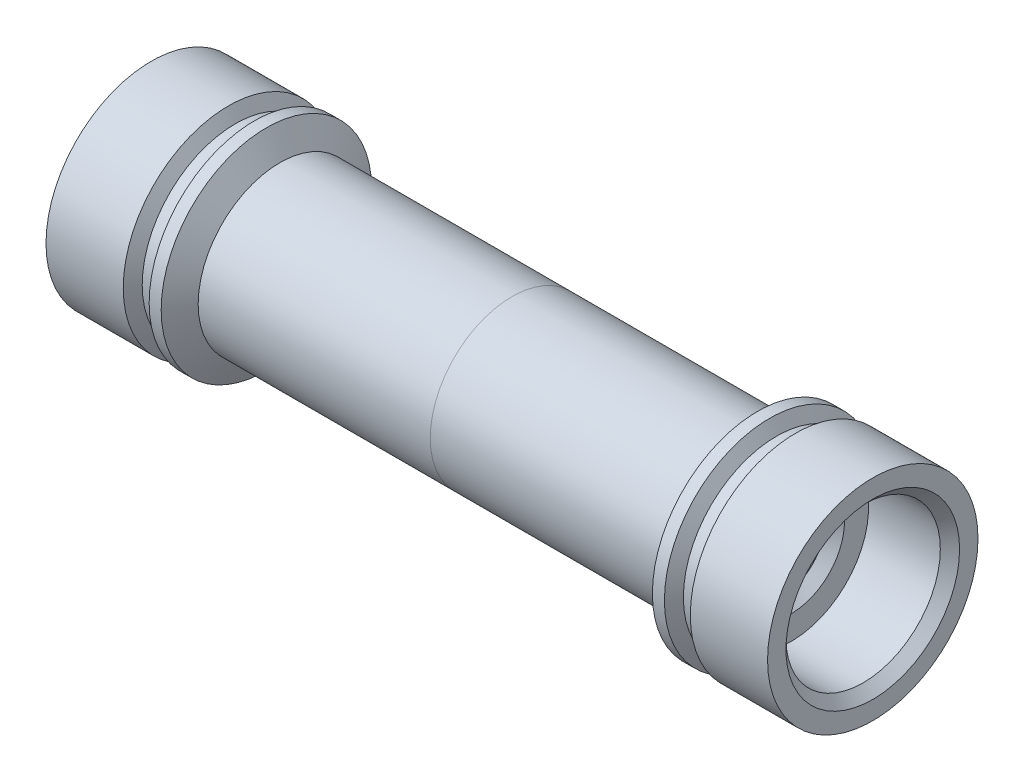
ISO-10303-21;
HEADER;
FILE_DESCRIPTION(('STEP AP214'),'2;1');
FILE_NAME('part.step','',(''),(''),'','','');
FILE_SCHEMA(('AUTOMOTIVE_DESIGN { 1 0 10303 214 1 1 1 1 }'));
ENDSEC;
DATA;
#1=APPLICATION_CONTEXT('core data for automotive mechanical design processes');
#2=APPLICATION_PROTOCOL_DEFINITION('international standard','automotive_design',2000,#1);
#3=PRODUCT_CONTEXT('',#1,'mechanical');
#4=PRODUCT('Part','Part','',(#3));
#5=PRODUCT_RELATED_PRODUCT_CATEGORY('part','',(#4));
#6=PRODUCT_DEFINITION_FORMATION('','',#4);
#7=PRODUCT_DEFINITION_CONTEXT('part definition',#1,'design');
#8=PRODUCT_DEFINITION('design','',#6,#7);
#9=PRODUCT_DEFINITION_SHAPE('','',#8);
#10=(LENGTH_UNIT() NAMED_UNIT(*) SI_UNIT(.MILLI.,.METRE.));
#11=(NAMED_UNIT(*) PLANE_ANGLE_UNIT() SI_UNIT($,.RADIAN.));
#12=(NAMED_UNIT(*) SI_UNIT($,.STERADIAN.) SOLID_ANGLE_UNIT());
#13=UNCERTAINTY_MEASURE_WITH_UNIT(LENGTH_MEASURE(1.E-05),#10,'distance_accuracy_value','');
#14=(GEOMETRIC_REPRESENTATION_CONTEXT(3) GLOBAL_UNCERTAINTY_ASSIGNED_CONTEXT((#13)) GLOBAL_UNIT_ASSIGNED_CONTEXT((#10,
#11,#12)) REPRESENTATION_CONTEXT('',''));
#15=CARTESIAN_POINT('',(0.,0.,0.));
#16=DIRECTION('',(0.,0.,1.));
#17=DIRECTION('',(1.,0.,0.));
#18=AXIS2_PLACEMENT_3D('',#15,#16,#17);
#19=CARTESIAN_POINT('',(12.9683825790646,0.,0.));
#20=DIRECTION('',(1.,0.,0.));
#21=DIRECTION('',(0.,0.,1.));
#22=AXIS2_PLACEMENT_3D('',#19,#20,#21);
#23=CONICAL_SURFACE('',#22,5.55625,1.0471975511966);
#24=CARTESIAN_POINT('',(12.2534786082405,0.,0.));
#25=DIRECTION('',(-1.,0.,0.));
#26=DIRECTION('',(0.,0.,1.));
#27=AXIS2_PLACEMENT_3D('',#24,#25,#26);
#28=CIRCLE('',#27,4.318);
#29=CARTESIAN_POINT('',(12.2534786082405,0.,4.318));
#30=VERTEX_POINT('',#29);
#31=EDGE_CURVE('E351',#30,#30,#28,.T.);
#32=ORIENTED_EDGE('',*,*,#31,.F.);
#33=EDGE_LOOP('',(#32));
#34=FACE_BOUND('',#33,.T.);
#35=CARTESIAN_POINT('',(12.9683825790646,0.,0.));
#36=DIRECTION('',(-1.,0.,0.));
#37=DIRECTION('',(0.,0.,1.));
#38=AXIS2_PLACEMENT_3D('',#35,#36,#37);
#39=CIRCLE('',#38,5.55625);
#40=CARTESIAN_POINT('',(12.9683825790646,0.,5.55625));
#41=VERTEX_POINT('',#40);
#42=EDGE_CURVE('E133',#41,#41,#39,.T.);
#43=ORIENTED_EDGE('',*,*,#42,.T.);
#44=EDGE_LOOP('',(#43));
#45=FACE_BOUND('',#44,.T.);
#46=ADVANCED_FACE('F63',(#34,#45),#23,.T.);
#47=CARTESIAN_POINT('',(19.05,0.,0.));
#48=DIRECTION('',(1.,0.,0.));
#49=DIRECTION('',(0.,0.,1.));
#50=AXIS2_PLACEMENT_3D('',#47,#48,#49);
#51=CYLINDRICAL_SURFACE('',#50,5.55625);
#52=ORIENTED_EDGE('',*,*,#42,.F.);
#53=EDGE_LOOP('',(#52));
#54=FACE_BOUND('',#53,.T.);
#55=CARTESIAN_POINT('',(13.6033825790646,0.,0.));
#56=DIRECTION('',(-1.,0.,0.));
#57=DIRECTION('',(0.,0.,1.));
#58=AXIS2_PLACEMENT_3D('',#55,#56,#57);
#59=CIRCLE('',#58,5.55625);
#60=CARTESIAN_POINT('',(13.6033825790646,0.,5.55625));
#61=VERTEX_POINT('',#60);
#62=EDGE_CURVE('E129',#61,#61,#59,.T.);
#63=ORIENTED_EDGE('',*,*,#62,.T.);
#64=EDGE_LOOP('',(#63));
#65=FACE_BOUND('',#64,.T.);
#66=ADVANCED_FACE('F160',(#54,#65),#51,.T.);
#67=CARTESIAN_POINT('',(13.97,0.,0.));
#68=DIRECTION('',(-1.,0.,0.));
#69=DIRECTION('',(0.,0.,-1.));
#70=AXIS2_PLACEMENT_3D('',#67,#68,#69);
#71=CONICAL_SURFACE('',#70,4.92125,1.0471975511966);
#72=ORIENTED_EDGE('',*,*,#62,.F.);
#73=EDGE_LOOP('',(#72));
#74=FACE_BOUND('',#73,.T.);
#75=CARTESIAN_POINT('',(13.97,0.,0.));
#76=DIRECTION('',(-1.,0.,0.));
#77=DIRECTION('',(0.,0.,1.));
#78=AXIS2_PLACEMENT_3D('',#75,#76,#77);
#79=CIRCLE('',#78,4.92125);
#80=CARTESIAN_POINT('',(13.97,0.,4.92125));
#81=VERTEX_POINT('',#80);
#82=EDGE_CURVE('E125',#81,#81,#79,.T.);
#83=ORIENTED_EDGE('',*,*,#82,.T.);
#84=EDGE_LOOP('',(#83));
#85=FACE_BOUND('',#84,.T.);
#86=ADVANCED_FACE('F164',(#74,#85),#71,.T.);
#87=CARTESIAN_POINT('',(19.05,0.,0.));
#88=DIRECTION('',(1.,0.,0.));
#89=DIRECTION('',(0.,0.,1.));
#90=AXIS2_PLACEMENT_3D('',#87,#88,#89);
#91=CYLINDRICAL_SURFACE('',#90,4.92125);
#92=ORIENTED_EDGE('',*,*,#82,.F.);
#93=EDGE_LOOP('',(#92));
#94=FACE_BOUND('',#93,.T.);
#95=CARTESIAN_POINT('',(14.605,0.,0.));
#96=DIRECTION('',(-1.,0.,0.));
#97=DIRECTION('',(0.,0.,1.));
#98=AXIS2_PLACEMENT_3D('',#95,#96,#97);
#99=CIRCLE('',#98,4.92125);
#100=CARTESIAN_POINT('',(14.605,0.,4.92125));
#101=VERTEX_POINT('',#100);
#102=EDGE_CURVE('E121',#101,#101,#99,.T.);
#103=ORIENTED_EDGE('',*,*,#102,.T.);
#104=EDGE_LOOP('',(#103));
#105=FACE_BOUND('',#104,.T.);
#106=ADVANCED_FACE('F172',(#94,#105),#91,.T.);
#107=CARTESIAN_POINT('',(14.9716174209354,0.,0.));
#108=DIRECTION('',(1.,0.,0.));
#109=DIRECTION('',(0.,0.,1.));
#110=AXIS2_PLACEMENT_3D('',#107,#108,#109);
#111=CONICAL_SURFACE('',#110,5.55625,1.0471975511966);
#112=ORIENTED_EDGE('',*,*,#102,.F.);
#113=EDGE_LOOP('',(#112));
#114=FACE_BOUND('',#113,.T.);
#115=CARTESIAN_POINT('',(14.9716174209354,0.,0.));
#116=DIRECTION('',(-1.,0.,0.));
#117=DIRECTION('',(0.,0.,1.));
#118=AXIS2_PLACEMENT_3D('',#115,#116,#117);
#119=CIRCLE('',#118,5.55625);
#120=CARTESIAN_POINT('',(14.9716174209354,0.,5.55625));
#121=VERTEX_POINT('',#120);
#122=EDGE_CURVE('E117',#121,#121,#119,.T.);
#123=ORIENTED_EDGE('',*,*,#122,.T.);
#124=EDGE_LOOP('',(#123));
#125=FACE_BOUND('',#124,.T.);
#126=ADVANCED_FACE('F176',(#114,#125),#111,.T.);
#127=CARTESIAN_POINT('',(19.05,0.,0.));
#128=DIRECTION('',(1.,0.,0.));
#129=DIRECTION('',(0.,0.,1.));
#130=AXIS2_PLACEMENT_3D('',#127,#128,#129);
#131=CYLINDRICAL_SURFACE('',#130,5.55625);
#132=ORIENTED_EDGE('',*,*,#122,.F.);
#133=EDGE_LOOP('',(#132));
#134=FACE_BOUND('',#133,.T.);
#135=CARTESIAN_POINT('',(19.05,0.,0.));
#136=DIRECTION('',(-1.,0.,0.));
#137=DIRECTION('',(0.,0.,1.));
#138=AXIS2_PLACEMENT_3D('',#135,#136,#137);
#139=CIRCLE('',#138,5.55625);
#140=CARTESIAN_POINT('',(19.05,0.,5.55625));
#141=VERTEX_POINT('',#140);
#142=EDGE_CURVE('E113',#141,#141,#139,.T.);
#143=ORIENTED_EDGE('',*,*,#142,.T.);
#144=EDGE_LOOP('',(#143));
#145=FACE_BOUND('',#144,.T.);
#146=ADVANCED_FACE('F180',(#134,#145),#131,.T.);
#147=CARTESIAN_POINT('',(19.05,0.,0.));
#148=DIRECTION('',(-1.,0.,0.));
#149=DIRECTION('',(0.,0.,-1.));
#150=AXIS2_PLACEMENT_3D('',#147,#148,#149);
#151=PLANE('',#150);
#152=CARTESIAN_POINT('',(19.05,0.,0.));
#153=DIRECTION('',(1.,0.,0.));
#154=DIRECTION('',(0.,0.,-1.));
#155=AXIS2_PLACEMENT_3D('',#152,#153,#154);
#156=CIRCLE('',#155,4.58300000000001);
#157=CARTESIAN_POINT('',(19.05,0.,-4.58300000000001));
#158=VERTEX_POINT('',#157);
#159=EDGE_CURVE('E12',#158,#158,#156,.T.);
#160=ORIENTED_EDGE('',*,*,#159,.F.);
#161=EDGE_LOOP('',(#160));
#162=FACE_BOUND('',#161,.T.);
#163=ORIENTED_EDGE('',*,*,#142,.F.);
#164=EDGE_LOOP('',(#163));
#165=FACE_BOUND('',#164,.T.);
#166=ADVANCED_FACE('F146',(#162,#165),#151,.F.);
#167=CARTESIAN_POINT('',(19.05,0.,0.));
#168=DIRECTION('',(1.,0.,0.));
#169=DIRECTION('',(0.,0.,1.));
#170=AXIS2_PLACEMENT_3D('',#167,#168,#169);
#171=CYLINDRICAL_SURFACE('',#170,4.075);
#172=CARTESIAN_POINT('',(18.542,0.,0.));
#173=DIRECTION('',(1.,0.,0.));
#174=DIRECTION('',(0.,0.,-1.));
#175=AXIS2_PLACEMENT_3D('',#172,#173,#174);
#176=CIRCLE('',#175,4.075);
#177=CARTESIAN_POINT('',(18.542,0.,-4.075));
#178=VERTEX_POINT('',#177);
#179=EDGE_CURVE('E71',#178,#178,#176,.F.);
#180=ORIENTED_EDGE('',*,*,#179,.F.);
#181=EDGE_LOOP('',(#180));
#182=FACE_BOUND('',#181,.T.);
#183=CARTESIAN_POINT('',(14.749999964,0.,0.));
#184=DIRECTION('',(-1.,0.,0.));
#185=DIRECTION('',(0.,0.,1.));
#186=AXIS2_PLACEMENT_3D('',#183,#184,#185);
#187=CIRCLE('',#186,4.075);
#188=CARTESIAN_POINT('',(14.749999964,0.,4.075));
#189=VERTEX_POINT('',#188);
#190=EDGE_CURVE('E109',#189,#189,#187,.T.);
#191=ORIENTED_EDGE('',*,*,#190,.T.);
#192=EDGE_LOOP('',(#191));
#193=FACE_BOUND('',#192,.T.);
#194=ADVANCED_FACE('F142',(#182,#193),#171,.F.);
#195=CARTESIAN_POINT('',(14.749999964,0.,0.));
#196=DIRECTION('',(-1.,0.,0.));
#197=DIRECTION('',(0.,0.,-1.));
#198=AXIS2_PLACEMENT_3D('',#195,#196,#197);
#199=PLANE('',#198);
#200=CARTESIAN_POINT('',(14.749999964,0.,0.));
#201=DIRECTION('',(-1.,0.,0.));
#202=DIRECTION('',(0.,0.,1.));
#203=AXIS2_PLACEMENT_3D('',#200,#201,#202);
#204=CIRCLE('',#203,2.805);
#205=CARTESIAN_POINT('',(14.749999964,0.,2.805));
#206=VERTEX_POINT('',#205);
#207=EDGE_CURVE('E105',#206,#206,#204,.T.);
#208=ORIENTED_EDGE('',*,*,#207,.T.);
#209=EDGE_LOOP('',(#208));
#210=FACE_BOUND('',#209,.T.);
#211=ORIENTED_EDGE('',*,*,#190,.F.);
#212=EDGE_LOOP('',(#211));
#213=FACE_BOUND('',#212,.T.);
#214=ADVANCED_FACE('F145',(#210,#213),#199,.F.);
#215=CARTESIAN_POINT('',(14.749999964,0.,0.));
#216=DIRECTION('',(1.,0.,0.));
#217=DIRECTION('',(0.,0.,1.));
#218=AXIS2_PLACEMENT_3D('',#215,#216,#217);
#219=CONICAL_SURFACE('',#218,2.805,0.785398163397447);
#220=CARTESIAN_POINT('',(14.241999964,0.,0.));
#221=DIRECTION('',(-1.,0.,0.));
#222=DIRECTION('',(0.,0.,1.));
#223=AXIS2_PLACEMENT_3D('',#220,#221,#222);
#224=CIRCLE('',#223,2.297);
#225=CARTESIAN_POINT('',(14.241999964,0.,2.297));
#226=VERTEX_POINT('',#225);
#227=EDGE_CURVE('E102',#226,#226,#224,.T.);
#228=ORIENTED_EDGE('',*,*,#227,.T.);
#229=EDGE_LOOP('',(#228));
#230=FACE_BOUND('',#229,.T.);
#231=ORIENTED_EDGE('',*,*,#207,.F.);
#232=EDGE_LOOP('',(#231));
#233=FACE_BOUND('',#232,.T.);
#234=ADVANCED_FACE('F151',(#230,#233),#219,.F.);
#235=CARTESIAN_POINT('',(14.241999964,0.,0.));
#236=DIRECTION('',(-1.,0.,0.));
#237=DIRECTION('',(0.,0.,-1.));
#238=AXIS2_PLACEMENT_3D('',#235,#236,#237);
#239=PLANE('',#238);
#240=CARTESIAN_POINT('',(14.241999964,0.,0.));
#241=DIRECTION('',(-1.,0.,0.));
#242=DIRECTION('',(0.,0.,1.));
#243=AXIS2_PLACEMENT_3D('',#240,#241,#242);
#244=CIRCLE('',#243,1.905);
#245=CARTESIAN_POINT('',(14.241999964,0.,1.905));
#246=VERTEX_POINT('',#245);
#247=EDGE_CURVE('E91',#246,#246,#244,.T.);
#248=ORIENTED_EDGE('',*,*,#247,.T.);
#249=EDGE_LOOP('',(#248));
#250=FACE_BOUND('',#249,.T.);
#251=ORIENTED_EDGE('',*,*,#227,.F.);
#252=EDGE_LOOP('',(#251));
#253=FACE_BOUND('',#252,.T.);
#254=ADVANCED_FACE('F156',(#250,#253),#239,.F.);
#255=CARTESIAN_POINT('',(19.05,0.,0.));
#256=DIRECTION('',(1.,0.,0.));
#257=DIRECTION('',(0.,0.,1.));
#258=AXIS2_PLACEMENT_3D('',#255,#256,#257);
#259=CYLINDRICAL_SURFACE('',#258,1.905);
#260=CARTESIAN_POINT('',(9.098,0.,0.));
#261=DIRECTION('',(-1.,0.,0.));
#262=DIRECTION('',(0.,0.,1.));
#263=AXIS2_PLACEMENT_3D('',#260,#261,#262);
#264=CIRCLE('',#263,1.905);
#265=CARTESIAN_POINT('',(9.098,0.,1.905));
#266=VERTEX_POINT('',#265);
#267=EDGE_CURVE('E85',#266,#266,#264,.T.);
#268=ORIENTED_EDGE('',*,*,#267,.T.);
#269=EDGE_LOOP('',(#268));
#270=FACE_BOUND('',#269,.T.);
#271=ORIENTED_EDGE('',*,*,#247,.F.);
#272=EDGE_LOOP('',(#271));
#273=FACE_BOUND('',#272,.T.);
#274=ADVANCED_FACE('F211',(#270,#273),#259,.F.);
#275=CARTESIAN_POINT('',(9.098,0.,0.));
#276=DIRECTION('',(-1.,0.,0.));
#277=DIRECTION('',(0.,0.,-1.));
#278=AXIS2_PLACEMENT_3D('',#275,#276,#277);
#279=PLANE('',#278);
#280=ORIENTED_EDGE('',*,*,#267,.F.);
#281=EDGE_LOOP('',(#280));
#282=FACE_BOUND('',#281,.T.);
#283=ADVANCED_FACE('F78',(#282),#279,.F.);
#284=CARTESIAN_POINT('',(6.5,0.,0.));
#285=DIRECTION('',(-1.,0.,0.));
#286=DIRECTION('',(0.,0.,-1.));
#287=AXIS2_PLACEMENT_3D('',#284,#285,#286);
#288=CONICAL_SURFACE('',#287,1.625000052,0.78539816339745);
#289=CARTESIAN_POINT('',(8.12500005199999,0.,0.));
#290=VERTEX_POINT('',#289);
#291=VERTEX_LOOP('',#290);
#292=FACE_BOUND('',#291,.T.);
#293=CARTESIAN_POINT('',(6.5,0.,0.));
#294=DIRECTION('',(-1.,0.,0.));
#295=DIRECTION('',(0.,0.,1.));
#296=AXIS2_PLACEMENT_3D('',#293,#294,#295);
#297=CIRCLE('',#296,1.625000052);
#298=CARTESIAN_POINT('',(6.5,0.,1.625000052));
#299=VERTEX_POINT('',#298);
#300=EDGE_CURVE('E82',#299,#299,#297,.T.);
#301=ORIENTED_EDGE('',*,*,#300,.T.);
#302=EDGE_LOOP('',(#301));
#303=FACE_BOUND('',#302,.T.);
#304=ADVANCED_FACE('F74',(#292,#303),#288,.F.);
#305=CARTESIAN_POINT('',(19.05,0.,0.));
#306=DIRECTION('',(1.,0.,0.));
#307=DIRECTION('',(0.,0.,1.));
#308=AXIS2_PLACEMENT_3D('',#305,#306,#307);
#309=CYLINDRICAL_SURFACE('',#308,1.625000052);
#310=ORIENTED_EDGE('',*,*,#300,.F.);
#311=EDGE_LOOP('',(#310));
#312=FACE_BOUND('',#311,.T.);
#313=CARTESIAN_POINT('',(0.,0.,0.));
#314=DIRECTION('',(-1.,0.,0.));
#315=DIRECTION('',(0.,0.,1.));
#316=AXIS2_PLACEMENT_3D('',#313,#314,#315);
#317=CIRCLE('',#316,1.625000052);
#318=CARTESIAN_POINT('',(0.,0.,1.625000052));
#319=VERTEX_POINT('',#318);
#320=EDGE_CURVE('E86',#319,#319,#317,.T.);
#321=ORIENTED_EDGE('',*,*,#320,.T.);
#322=EDGE_LOOP('',(#321));
#323=FACE_BOUND('',#322,.T.);
#324=ADVANCED_FACE('F77',(#312,#323),#309,.F.);
#325=CARTESIAN_POINT('',(0.,0.,0.));
#326=DIRECTION('',(1.,0.,0.));
#327=DIRECTION('',(0.,0.,1.));
#328=AXIS2_PLACEMENT_3D('',#325,#326,#327);
#329=PLANE('',#328);
#330=CARTESIAN_POINT('',(0.,0.,0.));
#331=DIRECTION('',(-1.,0.,0.));
#332=DIRECTION('',(0.,0.,1.));
#333=AXIS2_PLACEMENT_3D('',#330,#331,#332);
#334=CIRCLE('',#333,4.318);
#335=CARTESIAN_POINT('',(0.,0.,4.318));
#336=VERTEX_POINT('',#335);
#337=EDGE_CURVE('E95',#336,#336,#334,.T.);
#338=ORIENTED_EDGE('',*,*,#337,.T.);
#339=EDGE_LOOP('',(#338));
#340=FACE_BOUND('',#339,.T.);
#341=ORIENTED_EDGE('',*,*,#320,.F.);
#342=EDGE_LOOP('',(#341));
#343=FACE_BOUND('',#342,.T.);
#344=ADVANCED_FACE('F197',(#340,#343),#329,.F.);
#345=CARTESIAN_POINT('',(19.05,0.,0.));
#346=DIRECTION('',(1.,0.,0.));
#347=DIRECTION('',(0.,0.,1.));
#348=AXIS2_PLACEMENT_3D('',#345,#346,#347);
#349=CYLINDRICAL_SURFACE('',#348,4.318);
#350=ORIENTED_EDGE('',*,*,#337,.F.);
#351=EDGE_LOOP('',(#350));
#352=FACE_BOUND('',#351,.T.);
#353=ORIENTED_EDGE('',*,*,#31,.T.);
#354=EDGE_LOOP('',(#353));
#355=FACE_BOUND('',#354,.T.);
#356=ADVANCED_FACE('F194',(#352,#355),#349,.T.);
#357=CARTESIAN_POINT('',(18.542,0.,0.));
#358=DIRECTION('',(1.,0.,0.));
#359=DIRECTION('',(0.,0.,1.));
#360=AXIS2_PLACEMENT_3D('',#357,#358,#359);
#361=CONICAL_SURFACE('',#360,4.075,0.785398163397453);
#362=ORIENTED_EDGE('',*,*,#159,.T.);
#363=EDGE_LOOP('',(#362));
#364=FACE_BOUND('',#363,.T.);
#365=ORIENTED_EDGE('',*,*,#179,.T.);
#366=EDGE_LOOP('',(#365));
#367=FACE_BOUND('',#366,.T.);
#368=ADVANCED_FACE('F65',(#364,#367),#361,.F.);
#369=CLOSED_SHELL('',(#46,#66,#86,#106,#126,#146,#166,#194,#214,#234,#254,#274,#283,#304,#324,
#344,#356,#368));
#370=MANIFOLD_SOLID_BREP('B2',#369);
#371=CARTESIAN_POINT('',(-12.9683825790646,0.,0.));
#372=DIRECTION('',(-1.,0.,0.));
#373=DIRECTION('',(0.,0.,1.));
#374=AXIS2_PLACEMENT_3D('',#371,#372,#373);
#375=CONICAL_SURFACE('',#374,5.55625,1.0471975511966);
#376=CARTESIAN_POINT('',(-12.2534786082405,0.,0.));
#377=DIRECTION('',(-1.,0.,0.));
#378=DIRECTION('',(0.,0.,1.));
#379=AXIS2_PLACEMENT_3D('',#376,#377,#378);
#380=CIRCLE('',#379,4.318);
#381=CARTESIAN_POINT('',(-12.2534786082405,0.,4.318));
#382=VERTEX_POINT('',#381);
#383=EDGE_CURVE('E520',#382,#382,#380,.T.);
#384=ORIENTED_EDGE('',*,*,#383,.T.);
#385=EDGE_LOOP('',(#384));
#386=FACE_BOUND('',#385,.T.);
#387=CARTESIAN_POINT('',(-12.9683825790646,0.,0.));
#388=DIRECTION('',(-1.,0.,0.));
#389=DIRECTION('',(0.,0.,1.));
#390=AXIS2_PLACEMENT_3D('',#387,#388,#389);
#391=CIRCLE('',#390,5.55625);
#392=CARTESIAN_POINT('',(-12.9683825790646,0.,5.55625));
#393=VERTEX_POINT('',#392);
#394=EDGE_CURVE('E439',#393,#393,#391,.T.);
#395=ORIENTED_EDGE('',*,*,#394,.F.);
#396=EDGE_LOOP('',(#395));
#397=FACE_BOUND('',#396,.T.);
#398=ADVANCED_FACE('F366',(#386,#397),#375,.T.);
#399=CARTESIAN_POINT('',(-19.05,0.,0.));
#400=DIRECTION('',(-1.,0.,0.));
#401=DIRECTION('',(0.,0.,1.));
#402=AXIS2_PLACEMENT_3D('',#399,#400,#401);
#403=CYLINDRICAL_SURFACE('',#402,5.55625);
#404=ORIENTED_EDGE('',*,*,#394,.T.);
#405=EDGE_LOOP('',(#404));
#406=FACE_BOUND('',#405,.T.);
#407=CARTESIAN_POINT('',(-13.6033825790646,0.,0.));
#408=DIRECTION('',(-1.,0.,0.));
#409=DIRECTION('',(0.,0.,1.));
#410=AXIS2_PLACEMENT_3D('',#407,#408,#409);
#411=CIRCLE('',#410,5.55625);
#412=CARTESIAN_POINT('',(-13.6033825790646,0.,5.55625));
#413=VERTEX_POINT('',#412);
#414=EDGE_CURVE('E435',#413,#413,#411,.T.);
#415=ORIENTED_EDGE('',*,*,#414,.F.);
#416=EDGE_LOOP('',(#415));
#417=FACE_BOUND('',#416,.T.);
#418=ADVANCED_FACE('F460',(#406,#417),#403,.T.);
#419=CARTESIAN_POINT('',(-13.97,0.,0.));
#420=DIRECTION('',(1.,0.,0.));
#421=DIRECTION('',(0.,0.,-1.));
#422=AXIS2_PLACEMENT_3D('',#419,#420,#421);
#423=CONICAL_SURFACE('',#422,4.92125,1.0471975511966);
#424=ORIENTED_EDGE('',*,*,#414,.T.);
#425=EDGE_LOOP('',(#424));
#426=FACE_BOUND('',#425,.T.);
#427=CARTESIAN_POINT('',(-13.97,0.,0.));
#428=DIRECTION('',(-1.,0.,0.));
#429=DIRECTION('',(0.,0.,1.));
#430=AXIS2_PLACEMENT_3D('',#427,#428,#429);
#431=CIRCLE('',#430,4.92125);
#432=CARTESIAN_POINT('',(-13.97,0.,4.92125));
#433=VERTEX_POINT('',#432);
#434=EDGE_CURVE('E431',#433,#433,#431,.T.);
#435=ORIENTED_EDGE('',*,*,#434,.F.);
#436=EDGE_LOOP('',(#435));
#437=FACE_BOUND('',#436,.T.);
#438=ADVANCED_FACE('F464',(#426,#437),#423,.T.);
#439=CARTESIAN_POINT('',(-19.05,0.,0.));
#440=DIRECTION('',(-1.,0.,0.));
#441=DIRECTION('',(0.,0.,1.));
#442=AXIS2_PLACEMENT_3D('',#439,#440,#441);
#443=CYLINDRICAL_SURFACE('',#442,4.92125);
#444=ORIENTED_EDGE('',*,*,#434,.T.);
#445=EDGE_LOOP('',(#444));
#446=FACE_BOUND('',#445,.T.);
#447=CARTESIAN_POINT('',(-14.605,0.,0.));
#448=DIRECTION('',(-1.,0.,0.));
#449=DIRECTION('',(0.,0.,1.));
#450=AXIS2_PLACEMENT_3D('',#447,#448,#449);
#451=CIRCLE('',#450,4.92125);
#452=CARTESIAN_POINT('',(-14.605,0.,4.92125));
#453=VERTEX_POINT('',#452);
#454=EDGE_CURVE('E427',#453,#453,#451,.T.);
#455=ORIENTED_EDGE('',*,*,#454,.F.);
#456=EDGE_LOOP('',(#455));
#457=FACE_BOUND('',#456,.T.);
#458=ADVANCED_FACE('F472',(#446,#457),#443,.T.);
#459=CARTESIAN_POINT('',(-14.9716174209354,0.,0.));
#460=DIRECTION('',(-1.,0.,0.));
#461=DIRECTION('',(0.,0.,1.));
#462=AXIS2_PLACEMENT_3D('',#459,#460,#461);
#463=CONICAL_SURFACE('',#462,5.55625,1.0471975511966);
#464=ORIENTED_EDGE('',*,*,#454,.T.);
#465=EDGE_LOOP('',(#464));
#466=FACE_BOUND('',#465,.T.);
#467=CARTESIAN_POINT('',(-14.9716174209354,0.,0.));
#468=DIRECTION('',(-1.,0.,0.));
#469=DIRECTION('',(0.,0.,1.));
#470=AXIS2_PLACEMENT_3D('',#467,#468,#469);
#471=CIRCLE('',#470,5.55625);
#472=CARTESIAN_POINT('',(-14.9716174209354,0.,5.55625));
#473=VERTEX_POINT('',#472);
#474=EDGE_CURVE('E423',#473,#473,#471,.T.);
#475=ORIENTED_EDGE('',*,*,#474,.F.);
#476=EDGE_LOOP('',(#475));
#477=FACE_BOUND('',#476,.T.);
#478=ADVANCED_FACE('F476',(#466,#477),#463,.T.);
#479=CARTESIAN_POINT('',(-19.05,0.,0.));
#480=DIRECTION('',(-1.,0.,0.));
#481=DIRECTION('',(0.,0.,1.));
#482=AXIS2_PLACEMENT_3D('',#479,#480,#481);
#483=CYLINDRICAL_SURFACE('',#482,5.55625);
#484=ORIENTED_EDGE('',*,*,#474,.T.);
#485=EDGE_LOOP('',(#484));
#486=FACE_BOUND('',#485,.T.);
#487=CARTESIAN_POINT('',(-19.05,0.,0.));
#488=DIRECTION('',(-1.,0.,0.));
#489=DIRECTION('',(0.,0.,1.));
#490=AXIS2_PLACEMENT_3D('',#487,#488,#489);
#491=CIRCLE('',#490,5.55625);
#492=CARTESIAN_POINT('',(-19.05,0.,5.55625));
#493=VERTEX_POINT('',#492);
#494=EDGE_CURVE('E419',#493,#493,#491,.T.);
#495=ORIENTED_EDGE('',*,*,#494,.F.);
#496=EDGE_LOOP('',(#495));
#497=FACE_BOUND('',#496,.T.);
#498=ADVANCED_FACE('F480',(#486,#497),#483,.T.);
#499=CARTESIAN_POINT('',(-19.05,0.,0.));
#500=DIRECTION('',(1.,0.,0.));
#501=DIRECTION('',(0.,0.,-1.));
#502=AXIS2_PLACEMENT_3D('',#499,#500,#501);
#503=PLANE('',#502);
#504=CARTESIAN_POINT('',(-19.05,0.,0.));
#505=DIRECTION('',(1.,0.,0.));
#506=DIRECTION('',(0.,0.,-1.));
#507=AXIS2_PLACEMENT_3D('',#504,#505,#506);
#508=CIRCLE('',#507,4.58300000000001);
#509=CARTESIAN_POINT('',(-19.05,0.,-4.58300000000001));
#510=VERTEX_POINT('',#509);
#511=EDGE_CURVE('E61',#510,#510,#508,.T.);
#512=ORIENTED_EDGE('',*,*,#511,.T.);
#513=EDGE_LOOP('',(#512));
#514=FACE_BOUND('',#513,.T.);
#515=ORIENTED_EDGE('',*,*,#494,.T.);
#516=EDGE_LOOP('',(#515));
#517=FACE_BOUND('',#516,.T.);
#518=ADVANCED_FACE('F484',(#514,#517),#503,.F.);
#519=CARTESIAN_POINT('',(-19.05,0.,0.));
#520=DIRECTION('',(-1.,0.,0.));
#521=DIRECTION('',(0.,0.,1.));
#522=AXIS2_PLACEMENT_3D('',#519,#520,#521);
#523=CYLINDRICAL_SURFACE('',#522,4.075);
#524=CARTESIAN_POINT('',(-18.542,0.,0.));
#525=DIRECTION('',(1.,0.,0.));
#526=DIRECTION('',(0.,0.,-1.));
#527=AXIS2_PLACEMENT_3D('',#524,#525,#526);
#528=CIRCLE('',#527,4.075);
#529=CARTESIAN_POINT('',(-18.542,0.,-4.075));
#530=VERTEX_POINT('',#529);
#531=EDGE_CURVE('E375',#530,#530,#528,.F.);
#532=ORIENTED_EDGE('',*,*,#531,.T.);
#533=EDGE_LOOP('',(#532));
#534=FACE_BOUND('',#533,.T.);
#535=CARTESIAN_POINT('',(-14.749999964,0.,0.));
#536=DIRECTION('',(-1.,0.,0.));
#537=DIRECTION('',(0.,0.,1.));
#538=AXIS2_PLACEMENT_3D('',#535,#536,#537);
#539=CIRCLE('',#538,4.075);
#540=CARTESIAN_POINT('',(-14.749999964,0.,4.075));
#541=VERTEX_POINT('',#540);
#542=EDGE_CURVE('E416',#541,#541,#539,.T.);
#543=ORIENTED_EDGE('',*,*,#542,.F.);
#544=EDGE_LOOP('',(#543));
#545=FACE_BOUND('',#544,.T.);
#546=ADVANCED_FACE('F447',(#534,#545),#523,.F.);
#547=CARTESIAN_POINT('',(-14.749999964,0.,0.));
#548=DIRECTION('',(1.,0.,0.));
#549=DIRECTION('',(0.,0.,-1.));
#550=AXIS2_PLACEMENT_3D('',#547,#548,#549);
#551=PLANE('',#550);
#552=CARTESIAN_POINT('',(-14.749999964,0.,0.));
#553=DIRECTION('',(-1.,0.,0.));
#554=DIRECTION('',(0.,0.,1.));
#555=AXIS2_PLACEMENT_3D('',#552,#553,#554);
#556=CIRCLE('',#555,2.805);
#557=CARTESIAN_POINT('',(-14.749999964,0.,2.805));
#558=VERTEX_POINT('',#557);
#559=EDGE_CURVE('E412',#558,#558,#556,.T.);
#560=ORIENTED_EDGE('',*,*,#559,.F.);
#561=EDGE_LOOP('',(#560));
#562=FACE_BOUND('',#561,.T.);
#563=ORIENTED_EDGE('',*,*,#542,.T.);
#564=EDGE_LOOP('',(#563));
#565=FACE_BOUND('',#564,.T.);
#566=ADVANCED_FACE('F491',(#562,#565),#551,.F.);
#567=CARTESIAN_POINT('',(-14.749999964,0.,0.));
#568=DIRECTION('',(-1.,0.,0.));
#569=DIRECTION('',(0.,0.,1.));
#570=AXIS2_PLACEMENT_3D('',#567,#568,#569);
#571=CONICAL_SURFACE('',#570,2.805,0.785398163397447);
#572=CARTESIAN_POINT('',(-14.241999964,0.,0.));
#573=DIRECTION('',(-1.,0.,0.));
#574=DIRECTION('',(0.,0.,1.));
#575=AXIS2_PLACEMENT_3D('',#572,#573,#574);
#576=CIRCLE('',#575,2.297);
#577=CARTESIAN_POINT('',(-14.241999964,0.,2.297));
#578=VERTEX_POINT('',#577);
#579=EDGE_CURVE('E408',#578,#578,#576,.T.);
#580=ORIENTED_EDGE('',*,*,#579,.F.);
#581=EDGE_LOOP('',(#580));
#582=FACE_BOUND('',#581,.T.);
#583=ORIENTED_EDGE('',*,*,#559,.T.);
#584=EDGE_LOOP('',(#583));
#585=FACE_BOUND('',#584,.T.);
#586=ADVANCED_FACE('F494',(#582,#585),#571,.F.);
#587=CARTESIAN_POINT('',(-14.241999964,0.,0.));
#588=DIRECTION('',(1.,0.,0.));
#589=DIRECTION('',(0.,0.,-1.));
#590=AXIS2_PLACEMENT_3D('',#587,#588,#589);
#591=PLANE('',#590);
#592=CARTESIAN_POINT('',(-14.241999964,0.,0.));
#593=DIRECTION('',(-1.,0.,0.));
#594=DIRECTION('',(0.,0.,1.));
#595=AXIS2_PLACEMENT_3D('',#592,#593,#594);
#596=CIRCLE('',#595,1.905);
#597=CARTESIAN_POINT('',(-14.241999964,0.,1.905));
#598=VERTEX_POINT('',#597);
#599=EDGE_CURVE('E397',#598,#598,#596,.T.);
#600=ORIENTED_EDGE('',*,*,#599,.F.);
#601=EDGE_LOOP('',(#600));
#602=FACE_BOUND('',#601,.T.);
#603=ORIENTED_EDGE('',*,*,#579,.T.);
#604=EDGE_LOOP('',(#603));
#605=FACE_BOUND('',#604,.T.);
#606=ADVANCED_FACE('F498',(#602,#605),#591,.F.);
#607=CARTESIAN_POINT('',(-19.05,0.,0.));
#608=DIRECTION('',(-1.,0.,0.));
#609=DIRECTION('',(0.,0.,1.));
#610=AXIS2_PLACEMENT_3D('',#607,#608,#609);
#611=CYLINDRICAL_SURFACE('',#610,1.905);
#612=CARTESIAN_POINT('',(-9.098,0.,0.));
#613=DIRECTION('',(-1.,0.,0.));
#614=DIRECTION('',(0.,0.,1.));
#615=AXIS2_PLACEMENT_3D('',#612,#613,#614);
#616=CIRCLE('',#615,1.905);
#617=CARTESIAN_POINT('',(-9.098,0.,1.905));
#618=VERTEX_POINT('',#617);
#619=EDGE_CURVE('E389',#618,#618,#616,.T.);
#620=ORIENTED_EDGE('',*,*,#619,.F.);
#621=EDGE_LOOP('',(#620));
#622=FACE_BOUND('',#621,.T.);
#623=ORIENTED_EDGE('',*,*,#599,.T.);
#624=EDGE_LOOP('',(#623));
#625=FACE_BOUND('',#624,.T.);
#626=ADVANCED_FACE('F502',(#622,#625),#611,.F.);
#627=CARTESIAN_POINT('',(-9.098,0.,0.));
#628=DIRECTION('',(1.,0.,0.));
#629=DIRECTION('',(0.,0.,-1.));
#630=AXIS2_PLACEMENT_3D('',#627,#628,#629);
#631=PLANE('',#630);
#632=ORIENTED_EDGE('',*,*,#619,.T.);
#633=EDGE_LOOP('',(#632));
#634=FACE_BOUND('',#633,.T.);
#635=ADVANCED_FACE('F382',(#634),#631,.F.);
#636=CARTESIAN_POINT('',(-6.5,0.,0.));
#637=DIRECTION('',(1.,0.,0.));
#638=DIRECTION('',(0.,0.,-1.));
#639=AXIS2_PLACEMENT_3D('',#636,#637,#638);
#640=CONICAL_SURFACE('',#639,1.625000052,0.78539816339745);
#641=CARTESIAN_POINT('',(-8.12500005199999,0.,0.));
#642=VERTEX_POINT('',#641);
#643=VERTEX_LOOP('',#642);
#644=FACE_BOUND('',#643,.T.);
#645=CARTESIAN_POINT('',(-6.5,0.,0.));
#646=DIRECTION('',(-1.,0.,0.));
#647=DIRECTION('',(0.,0.,1.));
#648=AXIS2_PLACEMENT_3D('',#645,#646,#647);
#649=CIRCLE('',#648,1.625000052);
#650=CARTESIAN_POINT('',(-6.5,0.,1.625000052));
#651=VERTEX_POINT('',#650);
#652=EDGE_CURVE('E386',#651,#651,#649,.T.);
#653=ORIENTED_EDGE('',*,*,#652,.F.);
#654=EDGE_LOOP('',(#653));
#655=FACE_BOUND('',#654,.T.);
#656=ADVANCED_FACE('F378',(#644,#655),#640,.F.);
#657=CARTESIAN_POINT('',(-19.05,0.,0.));
#658=DIRECTION('',(-1.,0.,0.));
#659=DIRECTION('',(0.,0.,1.));
#660=AXIS2_PLACEMENT_3D('',#657,#658,#659);
#661=CYLINDRICAL_SURFACE('',#660,1.625000052);
#662=ORIENTED_EDGE('',*,*,#652,.T.);
#663=EDGE_LOOP('',(#662));
#664=FACE_BOUND('',#663,.T.);
#665=CARTESIAN_POINT('',(0.,0.,0.));
#666=DIRECTION('',(-1.,0.,0.));
#667=DIRECTION('',(0.,0.,1.));
#668=AXIS2_PLACEMENT_3D('',#665,#666,#667);
#669=CIRCLE('',#668,1.625000052);
#670=CARTESIAN_POINT('',(0.,0.,1.625000052));
#671=VERTEX_POINT('',#670);
#672=EDGE_CURVE('E390',#671,#671,#669,.T.);
#673=ORIENTED_EDGE('',*,*,#672,.F.);
#674=EDGE_LOOP('',(#673));
#675=FACE_BOUND('',#674,.T.);
#676=ADVANCED_FACE('F381',(#664,#675),#661,.F.);
#677=CARTESIAN_POINT('',(0.,0.,0.));
#678=DIRECTION('',(-1.,0.,0.));
#679=DIRECTION('',(0.,0.,1.));
#680=AXIS2_PLACEMENT_3D('',#677,#678,#679);
#681=PLANE('',#680);
#682=CARTESIAN_POINT('',(0.,0.,0.));
#683=DIRECTION('',(-1.,0.,0.));
#684=DIRECTION('',(0.,0.,1.));
#685=AXIS2_PLACEMENT_3D('',#682,#683,#684);
#686=CIRCLE('',#685,4.318);
#687=CARTESIAN_POINT('',(0.,0.,4.318));
#688=VERTEX_POINT('',#687);
#689=EDGE_CURVE('E401',#688,#688,#686,.T.);
#690=ORIENTED_EDGE('',*,*,#689,.F.);
#691=EDGE_LOOP('',(#690));
#692=FACE_BOUND('',#691,.T.);
#693=ORIENTED_EDGE('',*,*,#672,.T.);
#694=EDGE_LOOP('',(#693));
#695=FACE_BOUND('',#694,.T.);
#696=ADVANCED_FACE('F455',(#692,#695),#681,.F.);
#697=CARTESIAN_POINT('',(-19.05,0.,0.));
#698=DIRECTION('',(-1.,0.,0.));
#699=DIRECTION('',(0.,0.,1.));
#700=AXIS2_PLACEMENT_3D('',#697,#698,#699);
#701=CYLINDRICAL_SURFACE('',#700,4.318);
#702=ORIENTED_EDGE('',*,*,#689,.T.);
#703=EDGE_LOOP('',(#702));
#704=FACE_BOUND('',#703,.T.);
#705=ORIENTED_EDGE('',*,*,#383,.F.);
#706=EDGE_LOOP('',(#705));
#707=FACE_BOUND('',#706,.T.);
#708=ADVANCED_FACE('F451',(#704,#707),#701,.T.);
#709=CARTESIAN_POINT('',(-18.542,0.,0.));
#710=DIRECTION('',(-1.,0.,0.));
#711=DIRECTION('',(0.,0.,1.));
#712=AXIS2_PLACEMENT_3D('',#709,#710,#711);
#713=CONICAL_SURFACE('',#712,4.075,0.785398163397453);
#714=ORIENTED_EDGE('',*,*,#511,.F.);
#715=EDGE_LOOP('',(#714));
#716=FACE_BOUND('',#715,.T.);
#717=ORIENTED_EDGE('',*,*,#531,.F.);
#718=EDGE_LOOP('',(#717));
#719=FACE_BOUND('',#718,.T.);
#720=ADVANCED_FACE('F369',(#716,#719),#713,.F.);
#721=CLOSED_SHELL('',(#398,#418,#438,#458,#478,#498,#518,#546,#566,#586,#606,#626,#635,#656,
#676,#696,#708,#720));
#722=MANIFOLD_SOLID_BREP('B6',#721);
#723=ADVANCED_BREP_SHAPE_REPRESENTATION('',(#18,#370,#722),#14);
#724=SHAPE_DEFINITION_REPRESENTATION(#9,#723);
ENDSEC;
END-ISO-10303-21;
